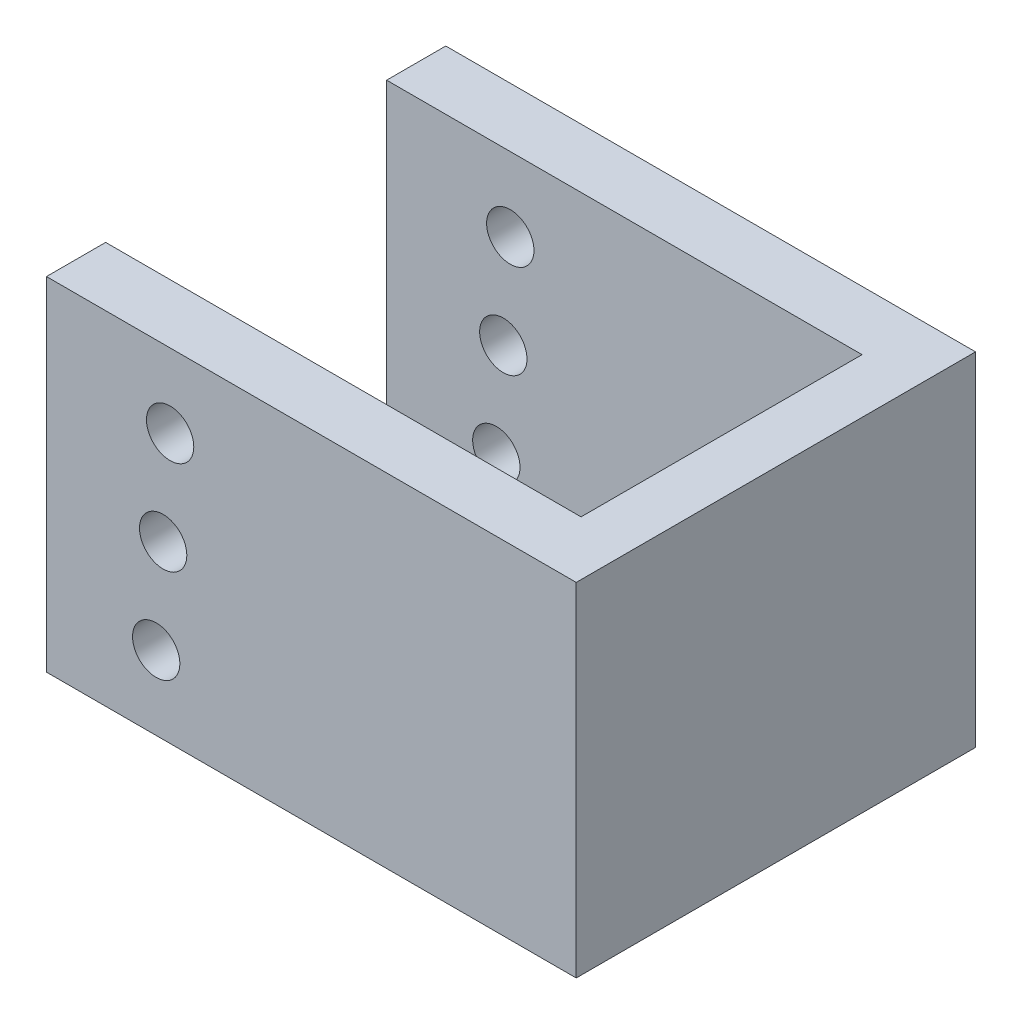
ISO-10303-21;
HEADER;
FILE_DESCRIPTION(('STEP AP214'),'2;1');
FILE_NAME('part.step','',(''),(''),'','','');
FILE_SCHEMA(('AUTOMOTIVE_DESIGN { 1 0 10303 214 1 1 1 1 }'));
ENDSEC;
DATA;
#1=APPLICATION_CONTEXT('core data for automotive mechanical design processes');
#2=APPLICATION_PROTOCOL_DEFINITION('international standard','automotive_design',2000,#1);
#3=PRODUCT_CONTEXT('',#1,'mechanical');
#4=PRODUCT('Part','Part','',(#3));
#5=PRODUCT_RELATED_PRODUCT_CATEGORY('part','',(#4));
#6=PRODUCT_DEFINITION_FORMATION('','',#4);
#7=PRODUCT_DEFINITION_CONTEXT('part definition',#1,'design');
#8=PRODUCT_DEFINITION('design','',#6,#7);
#9=PRODUCT_DEFINITION_SHAPE('','',#8);
#10=(LENGTH_UNIT() NAMED_UNIT(*) SI_UNIT(.MILLI.,.METRE.));
#11=(NAMED_UNIT(*) PLANE_ANGLE_UNIT() SI_UNIT($,.RADIAN.));
#12=(NAMED_UNIT(*) SI_UNIT($,.STERADIAN.) SOLID_ANGLE_UNIT());
#13=UNCERTAINTY_MEASURE_WITH_UNIT(LENGTH_MEASURE(1.E-05),#10,'distance_accuracy_value','');
#14=(GEOMETRIC_REPRESENTATION_CONTEXT(3) GLOBAL_UNCERTAINTY_ASSIGNED_CONTEXT((#13)) GLOBAL_UNIT_ASSIGNED_CONTEXT((#10,
#11,#12)) REPRESENTATION_CONTEXT('',''));
#15=CARTESIAN_POINT('',(0.,0.,0.));
#16=DIRECTION('',(0.,0.,1.));
#17=DIRECTION('',(1.,0.,0.));
#18=AXIS2_PLACEMENT_3D('',#15,#16,#17);
#19=CARTESIAN_POINT('',(-20.6364100395369,-64.9913269678388,-6.09999999999999));
#20=DIRECTION('',(0.,1.,0.));
#21=DIRECTION('',(0.,0.,1.));
#22=AXIS2_PLACEMENT_3D('',#19,#20,#21);
#23=PLANE('',#22);
#24=DIRECTION('',(1.,0.,0.));
#25=VECTOR('',#24,1.);
#26=CARTESIAN_POINT('',(-20.6364100395369,-64.9913269678388,-8.09999999999999));
#27=LINE('',#26,#25);
#28=CARTESIAN_POINT('',(-20.6364100395369,-64.9913269678388,-8.09999999999999));
#29=VERTEX_POINT('',#28);
#30=CARTESIAN_POINT('',(-6.50016526904138,-64.9913269678388,-8.09999999999999));
#31=VERTEX_POINT('',#30);
#32=EDGE_CURVE('E80',#29,#31,#27,.T.);
#33=ORIENTED_EDGE('',*,*,#32,.T.);
#34=DIRECTION('',(0.,0.,1.));
#35=VECTOR('',#34,1.);
#36=CARTESIAN_POINT('',(-6.50016526904138,-64.9913269678388,-17.6));
#37=LINE('',#36,#35);
#38=CARTESIAN_POINT('',(-6.50016526904138,-64.9913269678388,-17.6));
#39=VERTEX_POINT('',#38);
#40=EDGE_CURVE('E159',#39,#31,#37,.T.);
#41=ORIENTED_EDGE('',*,*,#40,.F.);
#42=DIRECTION('',(-1.,0.,0.));
#43=VECTOR('',#42,1.);
#44=CARTESIAN_POINT('',(-20.6364100395369,-64.9913269678388,-17.6));
#45=LINE('',#44,#43);
#46=CARTESIAN_POINT('',(-20.6364100395369,-64.9913269678388,-17.6));
#47=VERTEX_POINT('',#46);
#48=EDGE_CURVE('E128',#39,#47,#45,.T.);
#49=ORIENTED_EDGE('',*,*,#48,.T.);
#50=DIRECTION('',(0.,0.,1.));
#51=VECTOR('',#50,1.);
#52=CARTESIAN_POINT('',(-20.6364100395369,-64.9913269678388,-19.6));
#53=LINE('',#52,#51);
#54=CARTESIAN_POINT('',(-20.6364100395369,-64.9913269678388,-19.6));
#55=VERTEX_POINT('',#54);
#56=EDGE_CURVE('E152',#55,#47,#53,.T.);
#57=ORIENTED_EDGE('',*,*,#56,.F.);
#58=DIRECTION('',(-1.,0.,0.));
#59=VECTOR('',#58,1.);
#60=CARTESIAN_POINT('',(-20.6364100395369,-64.9913269678388,-19.6));
#61=LINE('',#60,#59);
#62=CARTESIAN_POINT('',(-2.7264718252411,-64.9913269678388,-19.6));
#63=VERTEX_POINT('',#62);
#64=EDGE_CURVE('E132',#63,#55,#61,.T.);
#65=ORIENTED_EDGE('',*,*,#64,.F.);
#66=DIRECTION('',(0.,0.,1.));
#67=VECTOR('',#66,1.);
#68=CARTESIAN_POINT('',(-2.7264718252411,-64.9913269678388,-17.6));
#69=LINE('',#68,#67);
#70=CARTESIAN_POINT('',(-2.7264718252411,-64.9913269678388,-6.09999999999999));
#71=VERTEX_POINT('',#70);
#72=EDGE_CURVE('E164',#63,#71,#69,.T.);
#73=ORIENTED_EDGE('',*,*,#72,.T.);
#74=DIRECTION('',(1.,0.,0.));
#75=VECTOR('',#74,1.);
#76=CARTESIAN_POINT('',(-20.6364100395369,-64.9913269678388,-6.09999999999999));
#77=LINE('',#76,#75);
#78=CARTESIAN_POINT('',(-20.6364100395369,-64.9913269678388,-6.09999999999999));
#79=VERTEX_POINT('',#78);
#80=EDGE_CURVE('E75',#79,#71,#77,.T.);
#81=ORIENTED_EDGE('',*,*,#80,.F.);
#82=DIRECTION('',(0.,0.,-1.));
#83=VECTOR('',#82,1.);
#84=CARTESIAN_POINT('',(-20.6364100395369,-64.9913269678388,-6.09999999999999));
#85=LINE('',#84,#83);
#86=EDGE_CURVE('E42',#79,#29,#85,.T.);
#87=ORIENTED_EDGE('',*,*,#86,.T.);
#88=EDGE_LOOP('',(#33,#41,#49,#57,#65,#73,#81,#87));
#89=FACE_BOUND('',#88,.T.);
#90=ADVANCED_FACE('F33',(#89),#23,.F.);
#91=CARTESIAN_POINT('',(-4.56285844044998,-53.4081338833241,-6.09999999999999));
#92=DIRECTION('',(0.,-1.,0.));
#93=DIRECTION('',(0.,0.,-1.));
#94=AXIS2_PLACEMENT_3D('',#91,#92,#93);
#95=PLANE('',#94);
#96=DIRECTION('',(-1.,0.,0.));
#97=VECTOR('',#96,1.);
#98=CARTESIAN_POINT('',(-4.56285844044998,-53.4081338833241,-8.09999999999999));
#99=LINE('',#98,#97);
#100=CARTESIAN_POINT('',(-4.56285844044998,-53.4081338833241,-8.09999999999999));
#101=VERTEX_POINT('',#100);
#102=CARTESIAN_POINT('',(-20.6364100395369,-53.4081338833241,-8.09999999999999));
#103=VERTEX_POINT('',#102);
#104=EDGE_CURVE('E65',#101,#103,#99,.T.);
#105=ORIENTED_EDGE('',*,*,#104,.T.);
#106=DIRECTION('',(0.,0.,-1.));
#107=VECTOR('',#106,1.);
#108=CARTESIAN_POINT('',(-20.6364100395369,-53.4081338833241,-6.09999999999999));
#109=LINE('',#108,#107);
#110=CARTESIAN_POINT('',(-20.6364100395369,-53.4081338833241,-6.09999999999999));
#111=VERTEX_POINT('',#110);
#112=EDGE_CURVE('E11',#111,#103,#109,.T.);
#113=ORIENTED_EDGE('',*,*,#112,.F.);
#114=DIRECTION('',(-1.,0.,0.));
#115=VECTOR('',#114,1.);
#116=CARTESIAN_POINT('',(-4.56285844044998,-53.4081338833241,-6.09999999999999));
#117=LINE('',#116,#115);
#118=CARTESIAN_POINT('',(-2.72647182524111,-53.4081338833241,-6.09999999999999));
#119=VERTEX_POINT('',#118);
#120=EDGE_CURVE('E167',#119,#111,#117,.T.);
#121=ORIENTED_EDGE('',*,*,#120,.F.);
#122=DIRECTION('',(0.,0.,1.));
#123=VECTOR('',#122,1.);
#124=CARTESIAN_POINT('',(-2.72647182524111,-53.4081338833241,-17.6));
#125=LINE('',#124,#123);
#126=CARTESIAN_POINT('',(-2.72647182524111,-53.4081338833241,-19.6));
#127=VERTEX_POINT('',#126);
#128=EDGE_CURVE('E90',#127,#119,#125,.T.);
#129=ORIENTED_EDGE('',*,*,#128,.F.);
#130=DIRECTION('',(1.,0.,0.));
#131=VECTOR('',#130,1.);
#132=CARTESIAN_POINT('',(-2.72647182524111,-53.4081338833241,-19.6));
#133=LINE('',#132,#131);
#134=CARTESIAN_POINT('',(-20.6364100395369,-53.4081338833241,-19.6));
#135=VERTEX_POINT('',#134);
#136=EDGE_CURVE('E139',#135,#127,#133,.T.);
#137=ORIENTED_EDGE('',*,*,#136,.F.);
#138=DIRECTION('',(0.,0.,1.));
#139=VECTOR('',#138,1.);
#140=CARTESIAN_POINT('',(-20.6364100395369,-53.4081338833241,-19.6));
#141=LINE('',#140,#139);
#142=CARTESIAN_POINT('',(-20.6364100395369,-53.4081338833241,-17.6));
#143=VERTEX_POINT('',#142);
#144=EDGE_CURVE('E142',#135,#143,#141,.T.);
#145=ORIENTED_EDGE('',*,*,#144,.T.);
#146=DIRECTION('',(1.,0.,0.));
#147=VECTOR('',#146,1.);
#148=CARTESIAN_POINT('',(-2.72647182524111,-53.4081338833241,-17.6));
#149=LINE('',#148,#147);
#150=CARTESIAN_POINT('',(-4.56285844044997,-53.4081338833241,-17.6));
#151=VERTEX_POINT('',#150);
#152=EDGE_CURVE('E133',#143,#151,#149,.T.);
#153=ORIENTED_EDGE('',*,*,#152,.T.);
#154=DIRECTION('',(0.,0.,1.));
#155=VECTOR('',#154,1.);
#156=CARTESIAN_POINT('',(-4.56285844044998,-53.4081338833241,-17.6));
#157=LINE('',#156,#155);
#158=EDGE_CURVE('E87',#151,#101,#157,.T.);
#159=ORIENTED_EDGE('',*,*,#158,.T.);
#160=EDGE_LOOP('',(#105,#113,#121,#129,#137,#145,#153,#159));
#161=FACE_BOUND('',#160,.T.);
#162=ADVANCED_FACE('F173',(#161),#95,.F.);
#163=CARTESIAN_POINT('',(-20.6364100395369,-53.4081338833241,-6.09999999999999));
#164=DIRECTION('',(1.,0.,0.));
#165=DIRECTION('',(0.,0.,-1.));
#166=AXIS2_PLACEMENT_3D('',#163,#164,#165);
#167=PLANE('',#166);
#168=DIRECTION('',(0.,-1.,0.));
#169=VECTOR('',#168,1.);
#170=CARTESIAN_POINT('',(-20.6364100395369,-53.4081338833241,-8.09999999999999));
#171=LINE('',#170,#169);
#172=EDGE_CURVE('E69',#103,#29,#171,.T.);
#173=ORIENTED_EDGE('',*,*,#172,.T.);
#174=ORIENTED_EDGE('',*,*,#86,.F.);
#175=DIRECTION('',(0.,-1.,0.));
#176=VECTOR('',#175,1.);
#177=CARTESIAN_POINT('',(-20.6364100395369,-53.4081338833241,-6.09999999999999));
#178=LINE('',#177,#176);
#179=EDGE_CURVE('E51',#111,#79,#178,.T.);
#180=ORIENTED_EDGE('',*,*,#179,.F.);
#181=ORIENTED_EDGE('',*,*,#112,.T.);
#182=EDGE_LOOP('',(#173,#174,#180,#181));
#183=FACE_BOUND('',#182,.T.);
#184=ADVANCED_FACE('F71',(#183),#167,.F.);
#185=CARTESIAN_POINT('',(0.,0.,-6.09999999999999));
#186=DIRECTION('',(0.,0.,-1.));
#187=DIRECTION('',(-1.,0.,0.));
#188=AXIS2_PLACEMENT_3D('',#185,#186,#187);
#189=PLANE('',#188);
#190=CARTESIAN_POINT('',(-16.9269298954164,-62.4913269678388,-6.09999999999999));
#191=DIRECTION('',(0.,0.,1.));
#192=DIRECTION('',(1.,0.,0.));
#193=AXIS2_PLACEMENT_3D('',#190,#191,#192);
#194=CIRCLE('',#193,0.799999999999999);
#195=CARTESIAN_POINT('',(-16.1269298954164,-62.4913269678388,-6.09999999999999));
#196=VERTEX_POINT('',#195);
#197=EDGE_CURVE('E228',#196,#196,#194,.T.);
#198=ORIENTED_EDGE('',*,*,#197,.F.);
#199=EDGE_LOOP('',(#198));
#200=FACE_BOUND('',#199,.T.);
#201=CARTESIAN_POINT('',(-16.6915744132208,-59.1997304255814,-6.09999999999999));
#202=DIRECTION('',(0.,0.,1.));
#203=DIRECTION('',(1.,0.,0.));
#204=AXIS2_PLACEMENT_3D('',#201,#202,#203);
#205=CIRCLE('',#204,0.799999999999999);
#206=CARTESIAN_POINT('',(-15.8915744132208,-59.1997304255814,-6.09999999999999));
#207=VERTEX_POINT('',#206);
#208=EDGE_CURVE('E103',#207,#207,#205,.T.);
#209=ORIENTED_EDGE('',*,*,#208,.F.);
#210=EDGE_LOOP('',(#209));
#211=FACE_BOUND('',#210,.T.);
#212=CARTESIAN_POINT('',(-16.4562189310253,-55.9081338833241,-6.09999999999999));
#213=DIRECTION('',(0.,0.,1.));
#214=DIRECTION('',(1.,0.,0.));
#215=AXIS2_PLACEMENT_3D('',#212,#213,#214);
#216=CIRCLE('',#215,0.799999999999999);
#217=CARTESIAN_POINT('',(-15.6562189310253,-55.9081338833241,-6.09999999999999));
#218=VERTEX_POINT('',#217);
#219=EDGE_CURVE('E99',#218,#218,#216,.T.);
#220=ORIENTED_EDGE('',*,*,#219,.F.);
#221=EDGE_LOOP('',(#220));
#222=FACE_BOUND('',#221,.T.);
#223=ORIENTED_EDGE('',*,*,#80,.T.);
#224=DIRECTION('',(0.,1.,0.));
#225=VECTOR('',#224,1.);
#226=CARTESIAN_POINT('',(-2.72647182524111,-53.4081338833241,-6.09999999999999));
#227=LINE('',#226,#225);
#228=EDGE_CURVE('E155',#71,#119,#227,.T.);
#229=ORIENTED_EDGE('',*,*,#228,.T.);
#230=ORIENTED_EDGE('',*,*,#120,.T.);
#231=ORIENTED_EDGE('',*,*,#179,.T.);
#232=EDGE_LOOP('',(#223,#229,#230,#231));
#233=FACE_BOUND('',#232,.T.);
#234=ADVANCED_FACE('F169',(#200,#211,#222,#233),#189,.F.);
#235=CARTESIAN_POINT('',(0.,0.,-8.09999999999999));
#236=DIRECTION('',(0.,0.,-1.));
#237=DIRECTION('',(-1.,0.,0.));
#238=AXIS2_PLACEMENT_3D('',#235,#236,#237);
#239=PLANE('',#238);
#240=CARTESIAN_POINT('',(-16.9269298954164,-62.4913269678388,-8.09999999999999));
#241=DIRECTION('',(0.,0.,-1.));
#242=DIRECTION('',(-1.,0.,0.));
#243=AXIS2_PLACEMENT_3D('',#240,#241,#242);
#244=CIRCLE('',#243,0.799999999999997);
#245=CARTESIAN_POINT('',(-17.7269298954164,-62.4913269678388,-8.09999999999999));
#246=VERTEX_POINT('',#245);
#247=EDGE_CURVE('E110',#246,#246,#244,.T.);
#248=ORIENTED_EDGE('',*,*,#247,.F.);
#249=EDGE_LOOP('',(#248));
#250=FACE_BOUND('',#249,.T.);
#251=CARTESIAN_POINT('',(-16.6915744132208,-59.1997304255814,-8.09999999999999));
#252=DIRECTION('',(0.,0.,-1.));
#253=DIRECTION('',(-1.,0.,0.));
#254=AXIS2_PLACEMENT_3D('',#251,#252,#253);
#255=CIRCLE('',#254,0.799999999999997);
#256=CARTESIAN_POINT('',(-17.4915744132208,-59.1997304255814,-8.09999999999999));
#257=VERTEX_POINT('',#256);
#258=EDGE_CURVE('E107',#257,#257,#255,.T.);
#259=ORIENTED_EDGE('',*,*,#258,.F.);
#260=EDGE_LOOP('',(#259));
#261=FACE_BOUND('',#260,.T.);
#262=CARTESIAN_POINT('',(-16.4562189310253,-55.9081338833241,-8.09999999999999));
#263=DIRECTION('',(0.,0.,-1.));
#264=DIRECTION('',(-1.,0.,0.));
#265=AXIS2_PLACEMENT_3D('',#262,#263,#264);
#266=CIRCLE('',#265,0.799999999999997);
#267=CARTESIAN_POINT('',(-17.2562189310253,-55.9081338833241,-8.09999999999999));
#268=VERTEX_POINT('',#267);
#269=EDGE_CURVE('E125',#268,#268,#266,.T.);
#270=ORIENTED_EDGE('',*,*,#269,.F.);
#271=EDGE_LOOP('',(#270));
#272=FACE_BOUND('',#271,.T.);
#273=ORIENTED_EDGE('',*,*,#32,.F.);
#274=ORIENTED_EDGE('',*,*,#172,.F.);
#275=ORIENTED_EDGE('',*,*,#104,.F.);
#276=DIRECTION('',(0.164960226175725,0.986300219902669,0.));
#277=VECTOR('',#276,1.);
#278=CARTESIAN_POINT('',(-4.56285844044998,-53.4081338833241,-8.09999999999999));
#279=LINE('',#278,#277);
#280=EDGE_CURVE('E86',#31,#101,#279,.T.);
#281=ORIENTED_EDGE('',*,*,#280,.F.);
#282=EDGE_LOOP('',(#273,#274,#275,#281));
#283=FACE_BOUND('',#282,.T.);
#284=ADVANCED_FACE('F84',(#250,#261,#272,#283),#239,.T.);
#285=CARTESIAN_POINT('',(-6.50016526904138,-64.9913269678388,-17.6));
#286=DIRECTION('',(-0.986300219902669,0.164960226175725,0.));
#287=DIRECTION('',(-0.164960226175725,-0.986300219902669,0.));
#288=AXIS2_PLACEMENT_3D('',#285,#286,#287);
#289=PLANE('',#288);
#290=ORIENTED_EDGE('',*,*,#40,.T.);
#291=ORIENTED_EDGE('',*,*,#280,.T.);
#292=ORIENTED_EDGE('',*,*,#158,.F.);
#293=DIRECTION('',(-0.164960226175725,-0.986300219902669,0.));
#294=VECTOR('',#293,1.);
#295=CARTESIAN_POINT('',(-6.50016526904138,-64.9913269678388,-17.6));
#296=LINE('',#295,#294);
#297=EDGE_CURVE('E156',#151,#39,#296,.T.);
#298=ORIENTED_EDGE('',*,*,#297,.T.);
#299=EDGE_LOOP('',(#290,#291,#292,#298));
#300=FACE_BOUND('',#299,.T.);
#301=ADVANCED_FACE('F183',(#300),#289,.T.);
#302=CARTESIAN_POINT('',(-2.72647182524111,-53.4081338833241,-17.6));
#303=DIRECTION('',(1.,0.,0.));
#304=DIRECTION('',(0.,1.,0.));
#305=AXIS2_PLACEMENT_3D('',#302,#303,#304);
#306=PLANE('',#305);
#307=ORIENTED_EDGE('',*,*,#228,.F.);
#308=ORIENTED_EDGE('',*,*,#72,.F.);
#309=DIRECTION('',(0.,-1.,0.));
#310=VECTOR('',#309,1.);
#311=CARTESIAN_POINT('',(-2.7264718252411,-64.9913269678388,-19.6));
#312=LINE('',#311,#310);
#313=EDGE_CURVE('E129',#127,#63,#312,.T.);
#314=ORIENTED_EDGE('',*,*,#313,.F.);
#315=ORIENTED_EDGE('',*,*,#128,.T.);
#316=EDGE_LOOP('',(#307,#308,#314,#315));
#317=FACE_BOUND('',#316,.T.);
#318=ADVANCED_FACE('F190',(#317),#306,.T.);
#319=CARTESIAN_POINT('',(0.,0.,-17.6));
#320=DIRECTION('',(0.,0.,1.));
#321=DIRECTION('',(1.,0.,0.));
#322=AXIS2_PLACEMENT_3D('',#319,#320,#321);
#323=PLANE('',#322);
#324=CARTESIAN_POINT('',(-16.9269298954164,-62.4913269678388,-17.6));
#325=DIRECTION('',(0.,0.,1.));
#326=DIRECTION('',(1.,0.,0.));
#327=AXIS2_PLACEMENT_3D('',#324,#325,#326);
#328=CIRCLE('',#327,0.799999999999997);
#329=CARTESIAN_POINT('',(-16.1269298954164,-62.4913269678388,-17.6));
#330=VERTEX_POINT('',#329);
#331=EDGE_CURVE('E115',#330,#330,#328,.T.);
#332=ORIENTED_EDGE('',*,*,#331,.F.);
#333=EDGE_LOOP('',(#332));
#334=FACE_BOUND('',#333,.T.);
#335=CARTESIAN_POINT('',(-16.6915744132208,-59.1997304255814,-17.6));
#336=DIRECTION('',(0.,0.,1.));
#337=DIRECTION('',(1.,0.,0.));
#338=AXIS2_PLACEMENT_3D('',#335,#336,#337);
#339=CIRCLE('',#338,0.799999999999997);
#340=CARTESIAN_POINT('',(-15.8915744132208,-59.1997304255814,-17.6));
#341=VERTEX_POINT('',#340);
#342=EDGE_CURVE('E100',#341,#341,#339,.T.);
#343=ORIENTED_EDGE('',*,*,#342,.F.);
#344=EDGE_LOOP('',(#343));
#345=FACE_BOUND('',#344,.T.);
#346=CARTESIAN_POINT('',(-16.4562189310253,-55.9081338833241,-17.6));
#347=DIRECTION('',(0.,0.,1.));
#348=DIRECTION('',(1.,0.,0.));
#349=AXIS2_PLACEMENT_3D('',#346,#347,#348);
#350=CIRCLE('',#349,0.799999999999997);
#351=CARTESIAN_POINT('',(-15.6562189310253,-55.9081338833241,-17.6));
#352=VERTEX_POINT('',#351);
#353=EDGE_CURVE('E96',#352,#352,#350,.T.);
#354=ORIENTED_EDGE('',*,*,#353,.F.);
#355=EDGE_LOOP('',(#354));
#356=FACE_BOUND('',#355,.T.);
#357=ORIENTED_EDGE('',*,*,#297,.F.);
#358=ORIENTED_EDGE('',*,*,#152,.F.);
#359=DIRECTION('',(0.,1.,0.));
#360=VECTOR('',#359,1.);
#361=CARTESIAN_POINT('',(-20.6364100395369,-53.4081338833241,-17.6));
#362=LINE('',#361,#360);
#363=EDGE_CURVE('E145',#47,#143,#362,.T.);
#364=ORIENTED_EDGE('',*,*,#363,.F.);
#365=ORIENTED_EDGE('',*,*,#48,.F.);
#366=EDGE_LOOP('',(#357,#358,#364,#365));
#367=FACE_BOUND('',#366,.T.);
#368=ADVANCED_FACE('F194',(#334,#345,#356,#367),#323,.T.);
#369=CARTESIAN_POINT('',(-20.6364100395369,-53.4081338833241,-19.6));
#370=DIRECTION('',(1.,0.,0.));
#371=DIRECTION('',(0.,0.,-1.));
#372=AXIS2_PLACEMENT_3D('',#369,#370,#371);
#373=PLANE('',#372);
#374=ORIENTED_EDGE('',*,*,#363,.T.);
#375=ORIENTED_EDGE('',*,*,#144,.F.);
#376=DIRECTION('',(0.,1.,0.));
#377=VECTOR('',#376,1.);
#378=CARTESIAN_POINT('',(-20.6364100395369,-53.4081338833241,-19.6));
#379=LINE('',#378,#377);
#380=EDGE_CURVE('E136',#55,#135,#379,.T.);
#381=ORIENTED_EDGE('',*,*,#380,.F.);
#382=ORIENTED_EDGE('',*,*,#56,.T.);
#383=EDGE_LOOP('',(#374,#375,#381,#382));
#384=FACE_BOUND('',#383,.T.);
#385=ADVANCED_FACE('F196',(#384),#373,.F.);
#386=CARTESIAN_POINT('',(0.,0.,-19.6));
#387=DIRECTION('',(0.,0.,1.));
#388=DIRECTION('',(1.,0.,0.));
#389=AXIS2_PLACEMENT_3D('',#386,#387,#388);
#390=PLANE('',#389);
#391=CARTESIAN_POINT('',(-16.9269298954164,-62.4913269678388,-19.6));
#392=DIRECTION('',(0.,0.,1.));
#393=DIRECTION('',(1.,0.,0.));
#394=AXIS2_PLACEMENT_3D('',#391,#392,#393);
#395=CIRCLE('',#394,0.799999999999997);
#396=CARTESIAN_POINT('',(-16.1269298954164,-62.4913269678388,-19.6));
#397=VERTEX_POINT('',#396);
#398=EDGE_CURVE('E36',#397,#397,#395,.T.);
#399=ORIENTED_EDGE('',*,*,#398,.T.);
#400=EDGE_LOOP('',(#399));
#401=FACE_BOUND('',#400,.T.);
#402=CARTESIAN_POINT('',(-16.6915744132208,-59.1997304255814,-19.6));
#403=DIRECTION('',(0.,0.,1.));
#404=DIRECTION('',(1.,0.,0.));
#405=AXIS2_PLACEMENT_3D('',#402,#403,#404);
#406=CIRCLE('',#405,0.799999999999997);
#407=CARTESIAN_POINT('',(-15.8915744132208,-59.1997304255814,-19.6));
#408=VERTEX_POINT('',#407);
#409=EDGE_CURVE('E102',#408,#408,#406,.T.);
#410=ORIENTED_EDGE('',*,*,#409,.T.);
#411=EDGE_LOOP('',(#410));
#412=FACE_BOUND('',#411,.T.);
#413=CARTESIAN_POINT('',(-16.4562189310253,-55.9081338833241,-19.6));
#414=DIRECTION('',(0.,0.,1.));
#415=DIRECTION('',(1.,0.,0.));
#416=AXIS2_PLACEMENT_3D('',#413,#414,#415);
#417=CIRCLE('',#416,0.799999999999997);
#418=CARTESIAN_POINT('',(-15.6562189310253,-55.9081338833241,-19.6));
#419=VERTEX_POINT('',#418);
#420=EDGE_CURVE('E98',#419,#419,#417,.T.);
#421=ORIENTED_EDGE('',*,*,#420,.T.);
#422=EDGE_LOOP('',(#421));
#423=FACE_BOUND('',#422,.T.);
#424=ORIENTED_EDGE('',*,*,#313,.T.);
#425=ORIENTED_EDGE('',*,*,#64,.T.);
#426=ORIENTED_EDGE('',*,*,#380,.T.);
#427=ORIENTED_EDGE('',*,*,#136,.T.);
#428=EDGE_LOOP('',(#424,#425,#426,#427));
#429=FACE_BOUND('',#428,.T.);
#430=ADVANCED_FACE('F199',(#401,#412,#423,#429),#390,.F.);
#431=CARTESIAN_POINT('',(-16.4562189310253,-55.9081338833241,-6.09999999999999));
#432=DIRECTION('',(0.,0.,1.));
#433=DIRECTION('',(1.,0.,0.));
#434=AXIS2_PLACEMENT_3D('',#431,#432,#433);
#435=CYLINDRICAL_SURFACE('',#434,0.799999999999997);
#436=ORIENTED_EDGE('',*,*,#353,.T.);
#437=EDGE_LOOP('',(#436));
#438=FACE_BOUND('',#437,.T.);
#439=ORIENTED_EDGE('',*,*,#420,.F.);
#440=EDGE_LOOP('',(#439));
#441=FACE_BOUND('',#440,.T.);
#442=ADVANCED_FACE('F206',(#438,#441),#435,.F.);
#443=ORIENTED_EDGE('',*,*,#269,.T.);
#444=EDGE_LOOP('',(#443));
#445=FACE_BOUND('',#444,.T.);
#446=ORIENTED_EDGE('',*,*,#219,.T.);
#447=EDGE_LOOP('',(#446));
#448=FACE_BOUND('',#447,.T.);
#449=ADVANCED_FACE('F210',(#445,#448),#435,.F.);
#450=CARTESIAN_POINT('',(-16.6915744132208,-59.1997304255814,-6.09999999999999));
#451=DIRECTION('',(0.,0.,1.));
#452=DIRECTION('',(1.,0.,0.));
#453=AXIS2_PLACEMENT_3D('',#450,#451,#452);
#454=CYLINDRICAL_SURFACE('',#453,0.799999999999997);
#455=ORIENTED_EDGE('',*,*,#342,.T.);
#456=EDGE_LOOP('',(#455));
#457=FACE_BOUND('',#456,.T.);
#458=ORIENTED_EDGE('',*,*,#409,.F.);
#459=EDGE_LOOP('',(#458));
#460=FACE_BOUND('',#459,.T.);
#461=ADVANCED_FACE('F212',(#457,#460),#454,.F.);
#462=ORIENTED_EDGE('',*,*,#258,.T.);
#463=EDGE_LOOP('',(#462));
#464=FACE_BOUND('',#463,.T.);
#465=ORIENTED_EDGE('',*,*,#208,.T.);
#466=EDGE_LOOP('',(#465));
#467=FACE_BOUND('',#466,.T.);
#468=ADVANCED_FACE('F215',(#464,#467),#454,.F.);
#469=CARTESIAN_POINT('',(-16.9269298954164,-62.4913269678388,-6.09999999999999));
#470=DIRECTION('',(0.,0.,1.));
#471=DIRECTION('',(1.,0.,0.));
#472=AXIS2_PLACEMENT_3D('',#469,#470,#471);
#473=CYLINDRICAL_SURFACE('',#472,0.799999999999997);
#474=ORIENTED_EDGE('',*,*,#331,.T.);
#475=EDGE_LOOP('',(#474));
#476=FACE_BOUND('',#475,.T.);
#477=ORIENTED_EDGE('',*,*,#398,.F.);
#478=EDGE_LOOP('',(#477));
#479=FACE_BOUND('',#478,.T.);
#480=ADVANCED_FACE('F218',(#476,#479),#473,.F.);
#481=ORIENTED_EDGE('',*,*,#247,.T.);
#482=EDGE_LOOP('',(#481));
#483=FACE_BOUND('',#482,.T.);
#484=ORIENTED_EDGE('',*,*,#197,.T.);
#485=EDGE_LOOP('',(#484));
#486=FACE_BOUND('',#485,.T.);
#487=ADVANCED_FACE('F216',(#483,#486),#473,.F.);
#488=CLOSED_SHELL('',(#90,#162,#184,#234,#284,#301,#318,#368,#385,#430,#442,#449,#461,#468,#480,#487));
#489=MANIFOLD_SOLID_BREP('B2',#488);
#490=ADVANCED_BREP_SHAPE_REPRESENTATION('',(#18,#489),#14);
#491=SHAPE_DEFINITION_REPRESENTATION(#9,#490);
ENDSEC;
END-ISO-10303-21;
